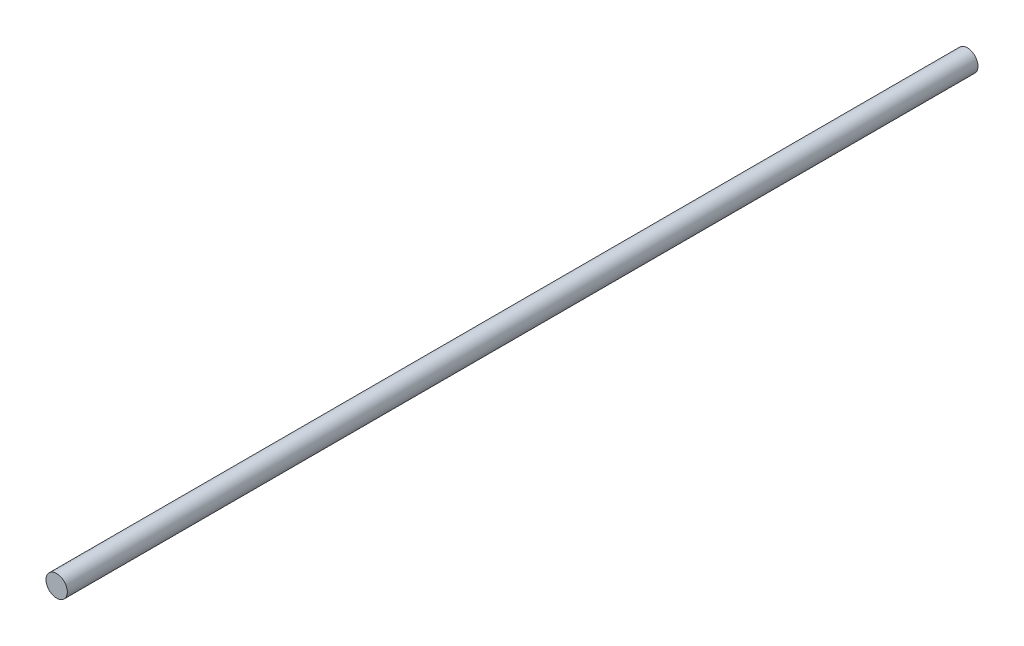
ISO-10303-21;
HEADER;
FILE_DESCRIPTION(('STEP AP214'),'2;1');
FILE_NAME('part.step','',(''),(''),'','','');
FILE_SCHEMA(('AUTOMOTIVE_DESIGN { 1 0 10303 214 1 1 1 1 }'));
ENDSEC;
DATA;
#1=APPLICATION_CONTEXT('core data for automotive mechanical design processes');
#2=APPLICATION_PROTOCOL_DEFINITION('international standard','automotive_design',2000,#1);
#3=PRODUCT_CONTEXT('',#1,'mechanical');
#4=PRODUCT('Part','Part','',(#3));
#5=PRODUCT_RELATED_PRODUCT_CATEGORY('part','',(#4));
#6=PRODUCT_DEFINITION_FORMATION('','',#4);
#7=PRODUCT_DEFINITION_CONTEXT('part definition',#1,'design');
#8=PRODUCT_DEFINITION('design','',#6,#7);
#9=PRODUCT_DEFINITION_SHAPE('','',#8);
#10=(LENGTH_UNIT() NAMED_UNIT(*) SI_UNIT(.MILLI.,.METRE.));
#11=(NAMED_UNIT(*) PLANE_ANGLE_UNIT() SI_UNIT($,.RADIAN.));
#12=(NAMED_UNIT(*) SI_UNIT($,.STERADIAN.) SOLID_ANGLE_UNIT());
#13=UNCERTAINTY_MEASURE_WITH_UNIT(LENGTH_MEASURE(1.E-05),#10,'distance_accuracy_value','');
#14=(GEOMETRIC_REPRESENTATION_CONTEXT(3) GLOBAL_UNCERTAINTY_ASSIGNED_CONTEXT((#13)) GLOBAL_UNIT_ASSIGNED_CONTEXT((#10,
#11,#12)) REPRESENTATION_CONTEXT('',''));
#15=CARTESIAN_POINT('',(0.,0.,0.));
#16=DIRECTION('',(0.,0.,1.));
#17=DIRECTION('',(1.,0.,0.));
#18=AXIS2_PLACEMENT_3D('',#15,#16,#17);
#19=CARTESIAN_POINT('',(-2.21430534696631E-13,83.2872475907319,1503.));
#20=DIRECTION('',(0.,0.,-1.));
#21=DIRECTION('',(-1.,0.,0.));
#22=AXIS2_PLACEMENT_3D('',#19,#20,#21);
#23=CYLINDRICAL_SURFACE('',#22,10.);
#24=CARTESIAN_POINT('',(-2.21430534696631E-13,83.2872475907319,1503.));
#25=DIRECTION('',(0.,0.,1.));
#26=DIRECTION('',(1.,0.,0.));
#27=AXIS2_PLACEMENT_3D('',#24,#25,#26);
#28=CIRCLE('',#27,10.);
#29=CARTESIAN_POINT('',(9.99999999999978,83.2872475907319,1503.));
#30=VERTEX_POINT('',#29);
#31=EDGE_CURVE('E10',#30,#30,#28,.T.);
#32=ORIENTED_EDGE('',*,*,#31,.F.);
#33=EDGE_LOOP('',(#32));
#34=FACE_BOUND('',#33,.T.);
#35=CARTESIAN_POINT('',(-2.21430534696631E-13,83.2872475907319,650.));
#36=DIRECTION('',(0.,0.,1.));
#37=DIRECTION('',(1.,0.,0.));
#38=AXIS2_PLACEMENT_3D('',#35,#36,#37);
#39=CIRCLE('',#38,10.);
#40=CARTESIAN_POINT('',(9.99999999999978,83.2872475907319,650.));
#41=VERTEX_POINT('',#40);
#42=EDGE_CURVE('E37',#41,#41,#39,.T.);
#43=ORIENTED_EDGE('',*,*,#42,.T.);
#44=EDGE_LOOP('',(#43));
#45=FACE_BOUND('',#44,.T.);
#46=ADVANCED_FACE('F40',(#34,#45),#23,.T.);
#47=CARTESIAN_POINT('',(-2.21430534696631E-13,83.2872475907319,1503.));
#48=DIRECTION('',(0.,0.,1.));
#49=DIRECTION('',(1.,0.,0.));
#50=AXIS2_PLACEMENT_3D('',#47,#48,#49);
#51=PLANE('',#50);
#52=ORIENTED_EDGE('',*,*,#31,.T.);
#53=EDGE_LOOP('',(#52));
#54=FACE_BOUND('',#53,.T.);
#55=ADVANCED_FACE('F55',(#54),#51,.T.);
#56=CARTESIAN_POINT('',(-2.21430534696631E-13,83.2872475907319,650.));
#57=DIRECTION('',(0.,0.,1.));
#58=DIRECTION('',(1.,0.,0.));
#59=AXIS2_PLACEMENT_3D('',#56,#57,#58);
#60=PLANE('',#59);
#61=ORIENTED_EDGE('',*,*,#42,.F.);
#62=EDGE_LOOP('',(#61));
#63=FACE_BOUND('',#62,.T.);
#64=ADVANCED_FACE('F49',(#63),#60,.F.);
#65=CLOSED_SHELL('',(#46,#55,#64));
#66=MANIFOLD_SOLID_BREP('B2',#65);
#67=ADVANCED_BREP_SHAPE_REPRESENTATION('',(#18,#66),#14);
#68=SHAPE_DEFINITION_REPRESENTATION(#9,#67);
ENDSEC;
END-ISO-10303-21;
